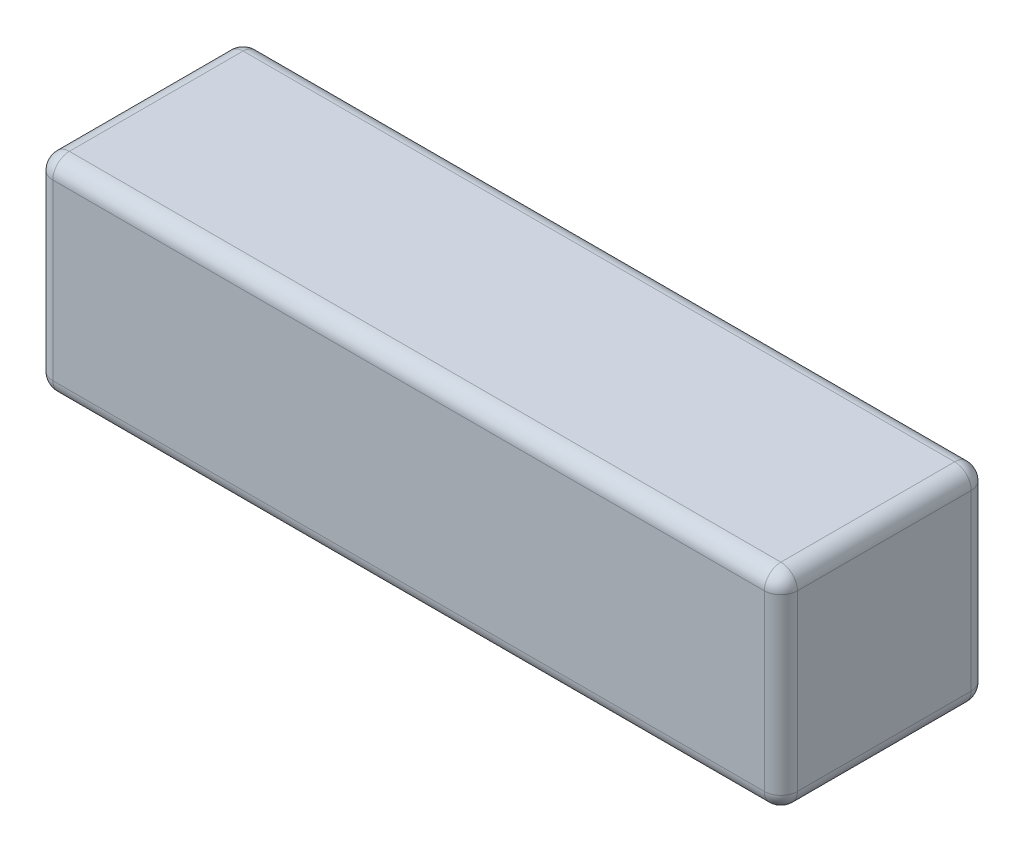
ISO-10303-21;
HEADER;
FILE_DESCRIPTION(('STEP AP214'),'2;1');
FILE_NAME('part.step','',(''),(''),'','','');
FILE_SCHEMA(('AUTOMOTIVE_DESIGN { 1 0 10303 214 1 1 1 1 }'));
ENDSEC;
DATA;
#1=APPLICATION_CONTEXT('core data for automotive mechanical design processes');
#2=APPLICATION_PROTOCOL_DEFINITION('international standard','automotive_design',2000,#1);
#3=PRODUCT_CONTEXT('',#1,'mechanical');
#4=PRODUCT('Part','Part','',(#3));
#5=PRODUCT_RELATED_PRODUCT_CATEGORY('part','',(#4));
#6=PRODUCT_DEFINITION_FORMATION('','',#4);
#7=PRODUCT_DEFINITION_CONTEXT('part definition',#1,'design');
#8=PRODUCT_DEFINITION('design','',#6,#7);
#9=PRODUCT_DEFINITION_SHAPE('','',#8);
#10=(LENGTH_UNIT() NAMED_UNIT(*) SI_UNIT(.MILLI.,.METRE.));
#11=(NAMED_UNIT(*) PLANE_ANGLE_UNIT() SI_UNIT($,.RADIAN.));
#12=(NAMED_UNIT(*) SI_UNIT($,.STERADIAN.) SOLID_ANGLE_UNIT());
#13=UNCERTAINTY_MEASURE_WITH_UNIT(LENGTH_MEASURE(1.E-05),#10,'distance_accuracy_value','');
#14=(GEOMETRIC_REPRESENTATION_CONTEXT(3) GLOBAL_UNCERTAINTY_ASSIGNED_CONTEXT((#13)) GLOBAL_UNIT_ASSIGNED_CONTEXT((#10,
#11,#12)) REPRESENTATION_CONTEXT('',''));
#15=CARTESIAN_POINT('',(0.,0.,0.));
#16=DIRECTION('',(0.,0.,1.));
#17=DIRECTION('',(1.,0.,0.));
#18=AXIS2_PLACEMENT_3D('',#15,#16,#17);
#19=CARTESIAN_POINT('',(90.,12.5,-12.5));
#20=DIRECTION('',(0.,0.,1.));
#21=DIRECTION('',(1.,0.,0.));
#22=AXIS2_PLACEMENT_3D('',#19,#20,#21);
#23=PLANE('',#22);
#24=DIRECTION('',(0.,1.,0.));
#25=VECTOR('',#24,1.);
#26=CARTESIAN_POINT('',(88.,-12.5,-12.5));
#27=LINE('',#26,#25);
#28=CARTESIAN_POINT('',(88.,10.5,-12.5));
#29=VERTEX_POINT('',#28);
#30=CARTESIAN_POINT('',(88.,-10.5,-12.5));
#31=VERTEX_POINT('',#30);
#32=EDGE_CURVE('E145',#29,#31,#27,.F.);
#33=ORIENTED_EDGE('',*,*,#32,.T.);
#34=DIRECTION('',(-1.,0.,0.));
#35=VECTOR('',#34,1.);
#36=CARTESIAN_POINT('',(90.,-10.5,-12.5));
#37=LINE('',#36,#35);
#38=CARTESIAN_POINT('',(2.,-10.5,-12.5));
#39=VERTEX_POINT('',#38);
#40=EDGE_CURVE('E140',#31,#39,#37,.T.);
#41=ORIENTED_EDGE('',*,*,#40,.T.);
#42=DIRECTION('',(0.,1.,0.));
#43=VECTOR('',#42,1.);
#44=CARTESIAN_POINT('',(2.,12.5,-12.5));
#45=LINE('',#44,#43);
#46=CARTESIAN_POINT('',(2.,10.5,-12.5));
#47=VERTEX_POINT('',#46);
#48=EDGE_CURVE('E135',#39,#47,#45,.T.);
#49=ORIENTED_EDGE('',*,*,#48,.T.);
#50=DIRECTION('',(-1.,0.,0.));
#51=VECTOR('',#50,1.);
#52=CARTESIAN_POINT('',(90.,10.5,-12.5));
#53=LINE('',#52,#51);
#54=EDGE_CURVE('E137',#47,#29,#53,.F.);
#55=ORIENTED_EDGE('',*,*,#54,.T.);
#56=EDGE_LOOP('',(#33,#41,#49,#55));
#57=FACE_BOUND('',#56,.T.);
#58=ADVANCED_FACE('F45',(#57),#23,.F.);
#59=CARTESIAN_POINT('',(90.,12.5,12.5));
#60=DIRECTION('',(0.,-1.,0.));
#61=DIRECTION('',(0.,0.,-1.));
#62=AXIS2_PLACEMENT_3D('',#59,#60,#61);
#63=PLANE('',#62);
#64=DIRECTION('',(0.,0.,1.));
#65=VECTOR('',#64,1.);
#66=CARTESIAN_POINT('',(88.,12.5,-12.5));
#67=LINE('',#66,#65);
#68=CARTESIAN_POINT('',(88.,12.5,10.5));
#69=VERTEX_POINT('',#68);
#70=CARTESIAN_POINT('',(88.,12.5,-10.5));
#71=VERTEX_POINT('',#70);
#72=EDGE_CURVE('E319',#69,#71,#67,.F.);
#73=ORIENTED_EDGE('',*,*,#72,.T.);
#74=DIRECTION('',(-1.,0.,0.));
#75=VECTOR('',#74,1.);
#76=CARTESIAN_POINT('',(90.,12.5,-10.5));
#77=LINE('',#76,#75);
#78=CARTESIAN_POINT('',(2.,12.5,-10.5));
#79=VERTEX_POINT('',#78);
#80=EDGE_CURVE('E326',#71,#79,#77,.T.);
#81=ORIENTED_EDGE('',*,*,#80,.T.);
#82=DIRECTION('',(0.,0.,1.));
#83=VECTOR('',#82,1.);
#84=CARTESIAN_POINT('',(2.,12.5,12.5));
#85=LINE('',#84,#83);
#86=CARTESIAN_POINT('',(2.,12.5,10.5));
#87=VERTEX_POINT('',#86);
#88=EDGE_CURVE('E322',#79,#87,#85,.T.);
#89=ORIENTED_EDGE('',*,*,#88,.T.);
#90=DIRECTION('',(-1.,0.,0.));
#91=VECTOR('',#90,1.);
#92=CARTESIAN_POINT('',(90.,12.5,10.5));
#93=LINE('',#92,#91);
#94=EDGE_CURVE('E316',#87,#69,#93,.F.);
#95=ORIENTED_EDGE('',*,*,#94,.T.);
#96=EDGE_LOOP('',(#73,#81,#89,#95));
#97=FACE_BOUND('',#96,.T.);
#98=ADVANCED_FACE('F364',(#97),#63,.F.);
#99=CARTESIAN_POINT('',(90.,12.5,12.5));
#100=DIRECTION('',(0.,0.,-1.));
#101=DIRECTION('',(0.,1.,0.));
#102=AXIS2_PLACEMENT_3D('',#99,#100,#101);
#103=PLANE('',#102);
#104=DIRECTION('',(-1.,0.,0.));
#105=VECTOR('',#104,1.);
#106=CARTESIAN_POINT('',(90.,10.5,12.5));
#107=LINE('',#106,#105);
#108=CARTESIAN_POINT('',(88.,10.5,12.5));
#109=VERTEX_POINT('',#108);
#110=CARTESIAN_POINT('',(2.,10.5,12.5));
#111=VERTEX_POINT('',#110);
#112=EDGE_CURVE('E329',#109,#111,#107,.T.);
#113=ORIENTED_EDGE('',*,*,#112,.T.);
#114=DIRECTION('',(0.,-1.,0.));
#115=VECTOR('',#114,1.);
#116=CARTESIAN_POINT('',(2.,12.5,12.5));
#117=LINE('',#116,#115);
#118=CARTESIAN_POINT('',(2.,-10.5,12.5));
#119=VERTEX_POINT('',#118);
#120=EDGE_CURVE('E252',#111,#119,#117,.T.);
#121=ORIENTED_EDGE('',*,*,#120,.T.);
#122=DIRECTION('',(-1.,0.,0.));
#123=VECTOR('',#122,1.);
#124=CARTESIAN_POINT('',(90.,-10.5,12.5));
#125=LINE('',#124,#123);
#126=CARTESIAN_POINT('',(88.,-10.5,12.5));
#127=VERTEX_POINT('',#126);
#128=EDGE_CURVE('E334',#119,#127,#125,.F.);
#129=ORIENTED_EDGE('',*,*,#128,.T.);
#130=DIRECTION('',(0.,-1.,0.));
#131=VECTOR('',#130,1.);
#132=CARTESIAN_POINT('',(88.,12.5,12.5));
#133=LINE('',#132,#131);
#134=EDGE_CURVE('E243',#127,#109,#133,.F.);
#135=ORIENTED_EDGE('',*,*,#134,.T.);
#136=EDGE_LOOP('',(#113,#121,#129,#135));
#137=FACE_BOUND('',#136,.T.);
#138=ADVANCED_FACE('F340',(#137),#103,.F.);
#139=CARTESIAN_POINT('',(90.,-12.5,12.5));
#140=DIRECTION('',(0.,1.,0.));
#141=DIRECTION('',(0.,0.,1.));
#142=AXIS2_PLACEMENT_3D('',#139,#140,#141);
#143=PLANE('',#142);
#144=DIRECTION('',(0.,0.,-1.));
#145=VECTOR('',#144,1.);
#146=CARTESIAN_POINT('',(2.,-12.5,12.5));
#147=LINE('',#146,#145);
#148=CARTESIAN_POINT('',(2.,-12.5,10.5));
#149=VERTEX_POINT('',#148);
#150=CARTESIAN_POINT('',(2.,-12.5,-10.5));
#151=VERTEX_POINT('',#150);
#152=EDGE_CURVE('E294',#149,#151,#147,.T.);
#153=ORIENTED_EDGE('',*,*,#152,.T.);
#154=DIRECTION('',(-1.,0.,0.));
#155=VECTOR('',#154,1.);
#156=CARTESIAN_POINT('',(90.,-12.5,-10.5));
#157=LINE('',#156,#155);
#158=CARTESIAN_POINT('',(88.,-12.5,-10.5));
#159=VERTEX_POINT('',#158);
#160=EDGE_CURVE('E291',#151,#159,#157,.F.);
#161=ORIENTED_EDGE('',*,*,#160,.T.);
#162=DIRECTION('',(0.,0.,-1.));
#163=VECTOR('',#162,1.);
#164=CARTESIAN_POINT('',(88.,-12.5,12.5));
#165=LINE('',#164,#163);
#166=CARTESIAN_POINT('',(88.,-12.5,10.5));
#167=VERTEX_POINT('',#166);
#168=EDGE_CURVE('E282',#159,#167,#165,.F.);
#169=ORIENTED_EDGE('',*,*,#168,.T.);
#170=DIRECTION('',(-1.,0.,0.));
#171=VECTOR('',#170,1.);
#172=CARTESIAN_POINT('',(90.,-12.5,10.5));
#173=LINE('',#172,#171);
#174=EDGE_CURVE('E288',#167,#149,#173,.T.);
#175=ORIENTED_EDGE('',*,*,#174,.T.);
#176=EDGE_LOOP('',(#153,#161,#169,#175));
#177=FACE_BOUND('',#176,.T.);
#178=ADVANCED_FACE('F292',(#177),#143,.F.);
#179=CARTESIAN_POINT('',(90.,0.,0.));
#180=DIRECTION('',(1.,0.,0.));
#181=DIRECTION('',(0.,0.,-1.));
#182=AXIS2_PLACEMENT_3D('',#179,#180,#181);
#183=PLANE('',#182);
#184=DIRECTION('',(0.,-1.,0.));
#185=VECTOR('',#184,1.);
#186=CARTESIAN_POINT('',(90.,-12.5,10.5));
#187=LINE('',#186,#185);
#188=CARTESIAN_POINT('',(90.,10.5,10.5));
#189=VERTEX_POINT('',#188);
#190=CARTESIAN_POINT('',(90.,-10.5,10.5));
#191=VERTEX_POINT('',#190);
#192=EDGE_CURVE('E66',#189,#191,#187,.T.);
#193=ORIENTED_EDGE('',*,*,#192,.T.);
#194=DIRECTION('',(0.,0.,-1.));
#195=VECTOR('',#194,1.);
#196=CARTESIAN_POINT('',(90.,-10.5,-12.5));
#197=LINE('',#196,#195);
#198=CARTESIAN_POINT('',(90.,-10.5,-10.5));
#199=VERTEX_POINT('',#198);
#200=EDGE_CURVE('E11',#191,#199,#197,.T.);
#201=ORIENTED_EDGE('',*,*,#200,.T.);
#202=DIRECTION('',(0.,1.,0.));
#203=VECTOR('',#202,1.);
#204=CARTESIAN_POINT('',(90.,12.5,-10.5));
#205=LINE('',#204,#203);
#206=CARTESIAN_POINT('',(90.,10.5,-10.5));
#207=VERTEX_POINT('',#206);
#208=EDGE_CURVE('E55',#199,#207,#205,.T.);
#209=ORIENTED_EDGE('',*,*,#208,.T.);
#210=DIRECTION('',(0.,0.,1.));
#211=VECTOR('',#210,1.);
#212=CARTESIAN_POINT('',(90.,10.5,12.5));
#213=LINE('',#212,#211);
#214=EDGE_CURVE('E247',#207,#189,#213,.T.);
#215=ORIENTED_EDGE('',*,*,#214,.T.);
#216=EDGE_LOOP('',(#193,#201,#209,#215));
#217=FACE_BOUND('',#216,.T.);
#218=ADVANCED_FACE('F574',(#217),#183,.T.);
#219=CARTESIAN_POINT('',(0.,0.,0.));
#220=DIRECTION('',(1.,0.,0.));
#221=DIRECTION('',(0.,0.,-1.));
#222=AXIS2_PLACEMENT_3D('',#219,#220,#221);
#223=PLANE('',#222);
#224=DIRECTION('',(0.,1.,0.));
#225=VECTOR('',#224,1.);
#226=CARTESIAN_POINT('',(0.,0.,-10.5));
#227=LINE('',#226,#225);
#228=CARTESIAN_POINT('',(0.,10.5,-10.5));
#229=VERTEX_POINT('',#228);
#230=CARTESIAN_POINT('',(0.,-10.5,-10.5));
#231=VERTEX_POINT('',#230);
#232=EDGE_CURVE('E169',#229,#231,#227,.F.);
#233=ORIENTED_EDGE('',*,*,#232,.T.);
#234=DIRECTION('',(0.,0.,-1.));
#235=VECTOR('',#234,1.);
#236=CARTESIAN_POINT('',(0.,-10.5,0.));
#237=LINE('',#236,#235);
#238=CARTESIAN_POINT('',(0.,-10.5,10.5));
#239=VERTEX_POINT('',#238);
#240=EDGE_CURVE('E312',#231,#239,#237,.F.);
#241=ORIENTED_EDGE('',*,*,#240,.T.);
#242=DIRECTION('',(0.,-1.,0.));
#243=VECTOR('',#242,1.);
#244=CARTESIAN_POINT('',(0.,0.,10.5));
#245=LINE('',#244,#243);
#246=CARTESIAN_POINT('',(0.,10.5,10.5));
#247=VERTEX_POINT('',#246);
#248=EDGE_CURVE('E299',#239,#247,#245,.F.);
#249=ORIENTED_EDGE('',*,*,#248,.T.);
#250=DIRECTION('',(0.,0.,1.));
#251=VECTOR('',#250,1.);
#252=CARTESIAN_POINT('',(0.,10.5,0.));
#253=LINE('',#252,#251);
#254=EDGE_CURVE('E303',#247,#229,#253,.F.);
#255=ORIENTED_EDGE('',*,*,#254,.T.);
#256=EDGE_LOOP('',(#233,#241,#249,#255));
#257=FACE_BOUND('',#256,.T.);
#258=ADVANCED_FACE('F565',(#257),#223,.F.);
#259=CARTESIAN_POINT('',(90.,10.5,10.5));
#260=DIRECTION('',(-1.,0.,0.));
#261=DIRECTION('',(0.,0.,1.));
#262=AXIS2_PLACEMENT_3D('',#259,#260,#261);
#263=CYLINDRICAL_SURFACE('',#262,2.);
#264=CARTESIAN_POINT('',(88.,10.5,10.5));
#265=DIRECTION('',(1.,0.,0.));
#266=DIRECTION('',(0.,0.,-1.));
#267=AXIS2_PLACEMENT_3D('',#264,#265,#266);
#268=CIRCLE('',#267,2.);
#269=EDGE_CURVE('E49',#69,#109,#268,.T.);
#270=ORIENTED_EDGE('',*,*,#269,.F.);
#271=ORIENTED_EDGE('',*,*,#94,.F.);
#272=CARTESIAN_POINT('',(2.,10.5,10.5));
#273=DIRECTION('',(-1.,0.,0.));
#274=DIRECTION('',(0.,0.,1.));
#275=AXIS2_PLACEMENT_3D('',#272,#273,#274);
#276=CIRCLE('',#275,2.);
#277=EDGE_CURVE('E222',#111,#87,#276,.T.);
#278=ORIENTED_EDGE('',*,*,#277,.F.);
#279=ORIENTED_EDGE('',*,*,#112,.F.);
#280=EDGE_LOOP('',(#270,#271,#278,#279));
#281=FACE_BOUND('',#280,.T.);
#282=ADVANCED_FACE('F47',(#281),#263,.T.);
#283=CARTESIAN_POINT('',(88.,10.5,10.5));
#284=DIRECTION('',(0.,0.,1.));
#285=DIRECTION('',(1.,0.,0.));
#286=AXIS2_PLACEMENT_3D('',#283,#284,#285);
#287=SPHERICAL_SURFACE('',#286,2.);
#288=CARTESIAN_POINT('',(88.,10.5,10.5));
#289=DIRECTION('',(0.,0.,1.));
#290=DIRECTION('',(1.,0.,0.));
#291=AXIS2_PLACEMENT_3D('',#288,#289,#290);
#292=CIRCLE('',#291,2.);
#293=EDGE_CURVE('E215',#69,#189,#292,.F.);
#294=ORIENTED_EDGE('',*,*,#293,.F.);
#295=ORIENTED_EDGE('',*,*,#269,.T.);
#296=CARTESIAN_POINT('',(88.,10.5,10.5));
#297=DIRECTION('',(0.,1.,0.));
#298=DIRECTION('',(0.,0.,1.));
#299=AXIS2_PLACEMENT_3D('',#296,#297,#298);
#300=CIRCLE('',#299,2.);
#301=EDGE_CURVE('E219',#189,#109,#300,.F.);
#302=ORIENTED_EDGE('',*,*,#301,.F.);
#303=EDGE_LOOP('',(#294,#295,#302));
#304=FACE_BOUND('',#303,.T.);
#305=ADVANCED_FACE('F236',(#304),#287,.T.);
#306=CARTESIAN_POINT('',(2.,10.5,10.5));
#307=DIRECTION('',(0.,1.,0.));
#308=DIRECTION('',(-1.,0.,0.));
#309=AXIS2_PLACEMENT_3D('',#306,#307,#308);
#310=SPHERICAL_SURFACE('',#309,2.);
#311=CARTESIAN_POINT('',(2.,10.5,10.5));
#312=DIRECTION('',(0.,1.,0.));
#313=DIRECTION('',(0.,0.,1.));
#314=AXIS2_PLACEMENT_3D('',#311,#312,#313);
#315=CIRCLE('',#314,2.);
#316=EDGE_CURVE('E208',#111,#247,#315,.F.);
#317=ORIENTED_EDGE('',*,*,#316,.F.);
#318=ORIENTED_EDGE('',*,*,#277,.T.);
#319=CARTESIAN_POINT('',(2.,10.5,10.5));
#320=DIRECTION('',(0.,0.,1.));
#321=DIRECTION('',(1.,0.,0.));
#322=AXIS2_PLACEMENT_3D('',#319,#320,#321);
#323=CIRCLE('',#322,2.);
#324=EDGE_CURVE('E212',#247,#87,#323,.F.);
#325=ORIENTED_EDGE('',*,*,#324,.F.);
#326=EDGE_LOOP('',(#317,#318,#325));
#327=FACE_BOUND('',#326,.T.);
#328=ADVANCED_FACE('F538',(#327),#310,.T.);
#329=CARTESIAN_POINT('',(88.,0.,10.5));
#330=DIRECTION('',(0.,1.,0.));
#331=DIRECTION('',(0.,0.,1.));
#332=AXIS2_PLACEMENT_3D('',#329,#330,#331);
#333=CYLINDRICAL_SURFACE('',#332,2.);
#334=ORIENTED_EDGE('',*,*,#301,.T.);
#335=ORIENTED_EDGE('',*,*,#134,.F.);
#336=CARTESIAN_POINT('',(88.,-10.5,10.5));
#337=DIRECTION('',(0.,-1.,0.));
#338=DIRECTION('',(0.,0.,-1.));
#339=AXIS2_PLACEMENT_3D('',#336,#337,#338);
#340=CIRCLE('',#339,2.);
#341=EDGE_CURVE('E200',#191,#127,#340,.T.);
#342=ORIENTED_EDGE('',*,*,#341,.F.);
#343=ORIENTED_EDGE('',*,*,#192,.F.);
#344=EDGE_LOOP('',(#334,#335,#342,#343));
#345=FACE_BOUND('',#344,.T.);
#346=ADVANCED_FACE('F242',(#345),#333,.T.);
#347=CARTESIAN_POINT('',(88.,10.5,0.));
#348=DIRECTION('',(0.,0.,-1.));
#349=DIRECTION('',(-1.,0.,0.));
#350=AXIS2_PLACEMENT_3D('',#347,#348,#349);
#351=CYLINDRICAL_SURFACE('',#350,2.);
#352=ORIENTED_EDGE('',*,*,#293,.T.);
#353=ORIENTED_EDGE('',*,*,#214,.F.);
#354=CARTESIAN_POINT('',(88.,10.5,-10.5));
#355=DIRECTION('',(0.,0.,-1.));
#356=DIRECTION('',(-1.,0.,0.));
#357=AXIS2_PLACEMENT_3D('',#354,#355,#356);
#358=CIRCLE('',#357,2.);
#359=EDGE_CURVE('E196',#71,#207,#358,.T.);
#360=ORIENTED_EDGE('',*,*,#359,.F.);
#361=ORIENTED_EDGE('',*,*,#72,.F.);
#362=EDGE_LOOP('',(#352,#353,#360,#361));
#363=FACE_BOUND('',#362,.T.);
#364=ADVANCED_FACE('F518',(#363),#351,.T.);
#365=CARTESIAN_POINT('',(90.,10.5,-10.5));
#366=DIRECTION('',(-1.,0.,0.));
#367=DIRECTION('',(0.,0.,1.));
#368=AXIS2_PLACEMENT_3D('',#365,#366,#367);
#369=CYLINDRICAL_SURFACE('',#368,2.);
#370=CARTESIAN_POINT('',(2.,10.5,-10.5));
#371=DIRECTION('',(-1.,0.,0.));
#372=DIRECTION('',(0.,0.,1.));
#373=AXIS2_PLACEMENT_3D('',#370,#371,#372);
#374=CIRCLE('',#373,2.);
#375=EDGE_CURVE('E152',#79,#47,#374,.T.);
#376=ORIENTED_EDGE('',*,*,#375,.F.);
#377=ORIENTED_EDGE('',*,*,#80,.F.);
#378=CARTESIAN_POINT('',(88.,10.5,-10.5));
#379=DIRECTION('',(1.,0.,0.));
#380=DIRECTION('',(0.,0.,-1.));
#381=AXIS2_PLACEMENT_3D('',#378,#379,#380);
#382=CIRCLE('',#381,2.);
#383=EDGE_CURVE('E155',#29,#71,#382,.T.);
#384=ORIENTED_EDGE('',*,*,#383,.F.);
#385=ORIENTED_EDGE('',*,*,#54,.F.);
#386=EDGE_LOOP('',(#376,#377,#384,#385));
#387=FACE_BOUND('',#386,.T.);
#388=ADVANCED_FACE('F150',(#387),#369,.T.);
#389=CARTESIAN_POINT('',(2.,10.5,12.5));
#390=DIRECTION('',(0.,0.,1.));
#391=DIRECTION('',(1.,0.,0.));
#392=AXIS2_PLACEMENT_3D('',#389,#390,#391);
#393=CYLINDRICAL_SURFACE('',#392,2.);
#394=ORIENTED_EDGE('',*,*,#324,.T.);
#395=ORIENTED_EDGE('',*,*,#88,.F.);
#396=CARTESIAN_POINT('',(2.,10.5,-10.5));
#397=DIRECTION('',(0.,0.,-1.));
#398=DIRECTION('',(0.,1.,0.));
#399=AXIS2_PLACEMENT_3D('',#396,#397,#398);
#400=CIRCLE('',#399,2.);
#401=EDGE_CURVE('E165',#229,#79,#400,.T.);
#402=ORIENTED_EDGE('',*,*,#401,.F.);
#403=ORIENTED_EDGE('',*,*,#254,.F.);
#404=EDGE_LOOP('',(#394,#395,#402,#403));
#405=FACE_BOUND('',#404,.T.);
#406=ADVANCED_FACE('F498',(#405),#393,.T.);
#407=CARTESIAN_POINT('',(2.,12.5,10.5));
#408=DIRECTION('',(0.,-1.,0.));
#409=DIRECTION('',(0.,0.,-1.));
#410=AXIS2_PLACEMENT_3D('',#407,#408,#409);
#411=CYLINDRICAL_SURFACE('',#410,2.);
#412=ORIENTED_EDGE('',*,*,#316,.T.);
#413=ORIENTED_EDGE('',*,*,#248,.F.);
#414=CARTESIAN_POINT('',(2.,-10.5,10.5));
#415=DIRECTION('',(0.,-1.,0.));
#416=DIRECTION('',(0.,0.,-1.));
#417=AXIS2_PLACEMENT_3D('',#414,#415,#416);
#418=CIRCLE('',#417,2.);
#419=EDGE_CURVE('E188',#119,#239,#418,.T.);
#420=ORIENTED_EDGE('',*,*,#419,.F.);
#421=ORIENTED_EDGE('',*,*,#120,.F.);
#422=EDGE_LOOP('',(#412,#413,#420,#421));
#423=FACE_BOUND('',#422,.T.);
#424=ADVANCED_FACE('F344',(#423),#411,.T.);
#425=CARTESIAN_POINT('',(90.,-10.5,10.5));
#426=DIRECTION('',(-1.,0.,0.));
#427=DIRECTION('',(0.,0.,1.));
#428=AXIS2_PLACEMENT_3D('',#425,#426,#427);
#429=CYLINDRICAL_SURFACE('',#428,2.);
#430=CARTESIAN_POINT('',(88.,-10.5,10.5));
#431=DIRECTION('',(1.,0.,0.));
#432=DIRECTION('',(0.,0.,-1.));
#433=AXIS2_PLACEMENT_3D('',#430,#431,#432);
#434=CIRCLE('',#433,2.);
#435=EDGE_CURVE('E204',#127,#167,#434,.T.);
#436=ORIENTED_EDGE('',*,*,#435,.F.);
#437=ORIENTED_EDGE('',*,*,#128,.F.);
#438=CARTESIAN_POINT('',(2.,-10.5,10.5));
#439=DIRECTION('',(-1.,0.,0.));
#440=DIRECTION('',(0.,0.,1.));
#441=AXIS2_PLACEMENT_3D('',#438,#439,#440);
#442=CIRCLE('',#441,2.);
#443=EDGE_CURVE('E185',#149,#119,#442,.T.);
#444=ORIENTED_EDGE('',*,*,#443,.F.);
#445=ORIENTED_EDGE('',*,*,#174,.F.);
#446=EDGE_LOOP('',(#436,#437,#444,#445));
#447=FACE_BOUND('',#446,.T.);
#448=ADVANCED_FACE('F350',(#447),#429,.T.);
#449=CARTESIAN_POINT('',(88.,-10.5,10.5));
#450=DIRECTION('',(0.,0.,1.));
#451=DIRECTION('',(1.,0.,0.));
#452=AXIS2_PLACEMENT_3D('',#449,#450,#451);
#453=SPHERICAL_SURFACE('',#452,2.);
#454=ORIENTED_EDGE('',*,*,#341,.T.);
#455=ORIENTED_EDGE('',*,*,#435,.T.);
#456=CARTESIAN_POINT('',(88.,-10.5,10.5));
#457=DIRECTION('',(0.,0.,1.));
#458=DIRECTION('',(1.,0.,0.));
#459=AXIS2_PLACEMENT_3D('',#456,#457,#458);
#460=CIRCLE('',#459,2.);
#461=EDGE_CURVE('E176',#191,#167,#460,.F.);
#462=ORIENTED_EDGE('',*,*,#461,.F.);
#463=EDGE_LOOP('',(#454,#455,#462));
#464=FACE_BOUND('',#463,.T.);
#465=ADVANCED_FACE('F352',(#464),#453,.T.);
#466=CARTESIAN_POINT('',(88.,10.5,-10.5));
#467=DIRECTION('',(0.,1.,0.));
#468=DIRECTION('',(0.,0.,1.));
#469=AXIS2_PLACEMENT_3D('',#466,#467,#468);
#470=SPHERICAL_SURFACE('',#469,2.);
#471=ORIENTED_EDGE('',*,*,#383,.T.);
#472=ORIENTED_EDGE('',*,*,#359,.T.);
#473=CARTESIAN_POINT('',(88.,10.5,-10.5));
#474=DIRECTION('',(0.,1.,0.));
#475=DIRECTION('',(0.,0.,1.));
#476=AXIS2_PLACEMENT_3D('',#473,#474,#475);
#477=CIRCLE('',#476,2.);
#478=EDGE_CURVE('E171',#29,#207,#477,.F.);
#479=ORIENTED_EDGE('',*,*,#478,.F.);
#480=EDGE_LOOP('',(#471,#472,#479));
#481=FACE_BOUND('',#480,.T.);
#482=ADVANCED_FACE('F354',(#481),#470,.T.);
#483=CARTESIAN_POINT('',(2.,10.5,-10.5));
#484=DIRECTION('',(0.,1.,0.));
#485=DIRECTION('',(0.,0.,1.));
#486=AXIS2_PLACEMENT_3D('',#483,#484,#485);
#487=SPHERICAL_SURFACE('',#486,2.);
#488=ORIENTED_EDGE('',*,*,#401,.T.);
#489=ORIENTED_EDGE('',*,*,#375,.T.);
#490=CARTESIAN_POINT('',(2.,10.5,-10.5));
#491=DIRECTION('',(0.,1.,0.));
#492=DIRECTION('',(0.,0.,1.));
#493=AXIS2_PLACEMENT_3D('',#490,#491,#492);
#494=CIRCLE('',#493,2.);
#495=EDGE_CURVE('E162',#229,#47,#494,.F.);
#496=ORIENTED_EDGE('',*,*,#495,.F.);
#497=EDGE_LOOP('',(#488,#489,#496));
#498=FACE_BOUND('',#497,.T.);
#499=ADVANCED_FACE('F161',(#498),#487,.T.);
#500=CARTESIAN_POINT('',(2.,-10.5,10.5));
#501=DIRECTION('',(0.,0.,1.));
#502=DIRECTION('',(1.,0.,0.));
#503=AXIS2_PLACEMENT_3D('',#500,#501,#502);
#504=SPHERICAL_SURFACE('',#503,2.);
#505=ORIENTED_EDGE('',*,*,#443,.T.);
#506=ORIENTED_EDGE('',*,*,#419,.T.);
#507=CARTESIAN_POINT('',(2.,-10.5,10.5));
#508=DIRECTION('',(0.,0.,1.));
#509=DIRECTION('',(1.,0.,0.));
#510=AXIS2_PLACEMENT_3D('',#507,#508,#509);
#511=CIRCLE('',#510,2.);
#512=EDGE_CURVE('E172',#149,#239,#511,.F.);
#513=ORIENTED_EDGE('',*,*,#512,.F.);
#514=EDGE_LOOP('',(#505,#506,#513));
#515=FACE_BOUND('',#514,.T.);
#516=ADVANCED_FACE('F394',(#515),#504,.T.);
#517=CARTESIAN_POINT('',(88.,-10.5,0.));
#518=DIRECTION('',(0.,0.,1.));
#519=DIRECTION('',(1.,0.,0.));
#520=AXIS2_PLACEMENT_3D('',#517,#518,#519);
#521=CYLINDRICAL_SURFACE('',#520,2.);
#522=ORIENTED_EDGE('',*,*,#461,.T.);
#523=ORIENTED_EDGE('',*,*,#168,.F.);
#524=CARTESIAN_POINT('',(88.,-10.5,-10.5));
#525=DIRECTION('',(0.,0.,-1.));
#526=DIRECTION('',(-1.,0.,0.));
#527=AXIS2_PLACEMENT_3D('',#524,#525,#526);
#528=CIRCLE('',#527,2.);
#529=EDGE_CURVE('E178',#199,#159,#528,.T.);
#530=ORIENTED_EDGE('',*,*,#529,.F.);
#531=ORIENTED_EDGE('',*,*,#200,.F.);
#532=EDGE_LOOP('',(#522,#523,#530,#531));
#533=FACE_BOUND('',#532,.T.);
#534=ADVANCED_FACE('F284',(#533),#521,.T.);
#535=CARTESIAN_POINT('',(88.,0.,-10.5));
#536=DIRECTION('',(0.,-1.,0.));
#537=DIRECTION('',(0.,0.,-1.));
#538=AXIS2_PLACEMENT_3D('',#535,#536,#537);
#539=CYLINDRICAL_SURFACE('',#538,2.);
#540=ORIENTED_EDGE('',*,*,#478,.T.);
#541=ORIENTED_EDGE('',*,*,#208,.F.);
#542=CARTESIAN_POINT('',(88.,-10.5,-10.5));
#543=DIRECTION('',(0.,-1.,0.));
#544=DIRECTION('',(1.,0.,0.));
#545=AXIS2_PLACEMENT_3D('',#542,#543,#544);
#546=CIRCLE('',#545,2.);
#547=EDGE_CURVE('E270',#31,#199,#546,.T.);
#548=ORIENTED_EDGE('',*,*,#547,.F.);
#549=ORIENTED_EDGE('',*,*,#32,.F.);
#550=EDGE_LOOP('',(#540,#541,#548,#549));
#551=FACE_BOUND('',#550,.T.);
#552=ADVANCED_FACE('F388',(#551),#539,.T.);
#553=CARTESIAN_POINT('',(2.,12.5,-10.5));
#554=DIRECTION('',(0.,1.,0.));
#555=DIRECTION('',(0.,0.,1.));
#556=AXIS2_PLACEMENT_3D('',#553,#554,#555);
#557=CYLINDRICAL_SURFACE('',#556,2.);
#558=ORIENTED_EDGE('',*,*,#495,.T.);
#559=ORIENTED_EDGE('',*,*,#48,.F.);
#560=CARTESIAN_POINT('',(2.,-10.5,-10.5));
#561=DIRECTION('',(0.,-1.,0.));
#562=DIRECTION('',(0.,0.,-1.));
#563=AXIS2_PLACEMENT_3D('',#560,#561,#562);
#564=CIRCLE('',#563,2.);
#565=EDGE_CURVE('E266',#231,#39,#564,.T.);
#566=ORIENTED_EDGE('',*,*,#565,.F.);
#567=ORIENTED_EDGE('',*,*,#232,.F.);
#568=EDGE_LOOP('',(#558,#559,#566,#567));
#569=FACE_BOUND('',#568,.T.);
#570=ADVANCED_FACE('F168',(#569),#557,.T.);
#571=CARTESIAN_POINT('',(2.,-10.5,12.5));
#572=DIRECTION('',(0.,0.,-1.));
#573=DIRECTION('',(-1.,0.,0.));
#574=AXIS2_PLACEMENT_3D('',#571,#572,#573);
#575=CYLINDRICAL_SURFACE('',#574,2.);
#576=ORIENTED_EDGE('',*,*,#512,.T.);
#577=ORIENTED_EDGE('',*,*,#240,.F.);
#578=CARTESIAN_POINT('',(2.,-10.5,-10.5));
#579=DIRECTION('',(0.,0.,-1.));
#580=DIRECTION('',(-1.,0.,0.));
#581=AXIS2_PLACEMENT_3D('',#578,#579,#580);
#582=CIRCLE('',#581,2.);
#583=EDGE_CURVE('E262',#151,#231,#582,.T.);
#584=ORIENTED_EDGE('',*,*,#583,.F.);
#585=ORIENTED_EDGE('',*,*,#152,.F.);
#586=EDGE_LOOP('',(#576,#577,#584,#585));
#587=FACE_BOUND('',#586,.T.);
#588=ADVANCED_FACE('F382',(#587),#575,.T.);
#589=CARTESIAN_POINT('',(88.,-10.5,-10.5));
#590=DIRECTION('',(1.,0.,0.));
#591=DIRECTION('',(0.,0.,-1.));
#592=AXIS2_PLACEMENT_3D('',#589,#590,#591);
#593=SPHERICAL_SURFACE('',#592,2.);
#594=ORIENTED_EDGE('',*,*,#547,.T.);
#595=ORIENTED_EDGE('',*,*,#529,.T.);
#596=CARTESIAN_POINT('',(88.,-10.5,-10.5));
#597=DIRECTION('',(1.,0.,0.));
#598=DIRECTION('',(0.,0.,-1.));
#599=AXIS2_PLACEMENT_3D('',#596,#597,#598);
#600=CIRCLE('',#599,2.);
#601=EDGE_CURVE('E259',#31,#159,#600,.F.);
#602=ORIENTED_EDGE('',*,*,#601,.F.);
#603=EDGE_LOOP('',(#594,#595,#602));
#604=FACE_BOUND('',#603,.T.);
#605=ADVANCED_FACE('F279',(#604),#593,.T.);
#606=CARTESIAN_POINT('',(2.,-10.5,-10.5));
#607=DIRECTION('',(-1.,0.,0.));
#608=DIRECTION('',(0.,0.,1.));
#609=AXIS2_PLACEMENT_3D('',#606,#607,#608);
#610=SPHERICAL_SURFACE('',#609,2.);
#611=ORIENTED_EDGE('',*,*,#583,.T.);
#612=ORIENTED_EDGE('',*,*,#565,.T.);
#613=CARTESIAN_POINT('',(2.,-10.5,-10.5));
#614=DIRECTION('',(-1.,0.,0.));
#615=DIRECTION('',(0.,0.,1.));
#616=AXIS2_PLACEMENT_3D('',#613,#614,#615);
#617=CIRCLE('',#616,2.);
#618=EDGE_CURVE('E256',#151,#39,#617,.F.);
#619=ORIENTED_EDGE('',*,*,#618,.F.);
#620=EDGE_LOOP('',(#611,#612,#619));
#621=FACE_BOUND('',#620,.T.);
#622=ADVANCED_FACE('F376',(#621),#610,.T.);
#623=CARTESIAN_POINT('',(90.,-10.5,-10.5));
#624=DIRECTION('',(-1.,0.,0.));
#625=DIRECTION('',(0.,0.,1.));
#626=AXIS2_PLACEMENT_3D('',#623,#624,#625);
#627=CYLINDRICAL_SURFACE('',#626,2.);
#628=ORIENTED_EDGE('',*,*,#601,.T.);
#629=ORIENTED_EDGE('',*,*,#160,.F.);
#630=ORIENTED_EDGE('',*,*,#618,.T.);
#631=ORIENTED_EDGE('',*,*,#40,.F.);
#632=EDGE_LOOP('',(#628,#629,#630,#631));
#633=FACE_BOUND('',#632,.T.);
#634=ADVANCED_FACE('F373',(#633),#627,.T.);
#635=CLOSED_SHELL('',(#58,#98,#138,#178,#218,#258,#282,#305,#328,#346,#364,#388,#406,#424,#448,
#465,#482,#499,#516,#534,#552,#570,#588,#605,#622,#634));
#636=MANIFOLD_SOLID_BREP('B2',#635);
#637=ADVANCED_BREP_SHAPE_REPRESENTATION('',(#18,#636),#14);
#638=SHAPE_DEFINITION_REPRESENTATION(#9,#637);
ENDSEC;
END-ISO-10303-21;
